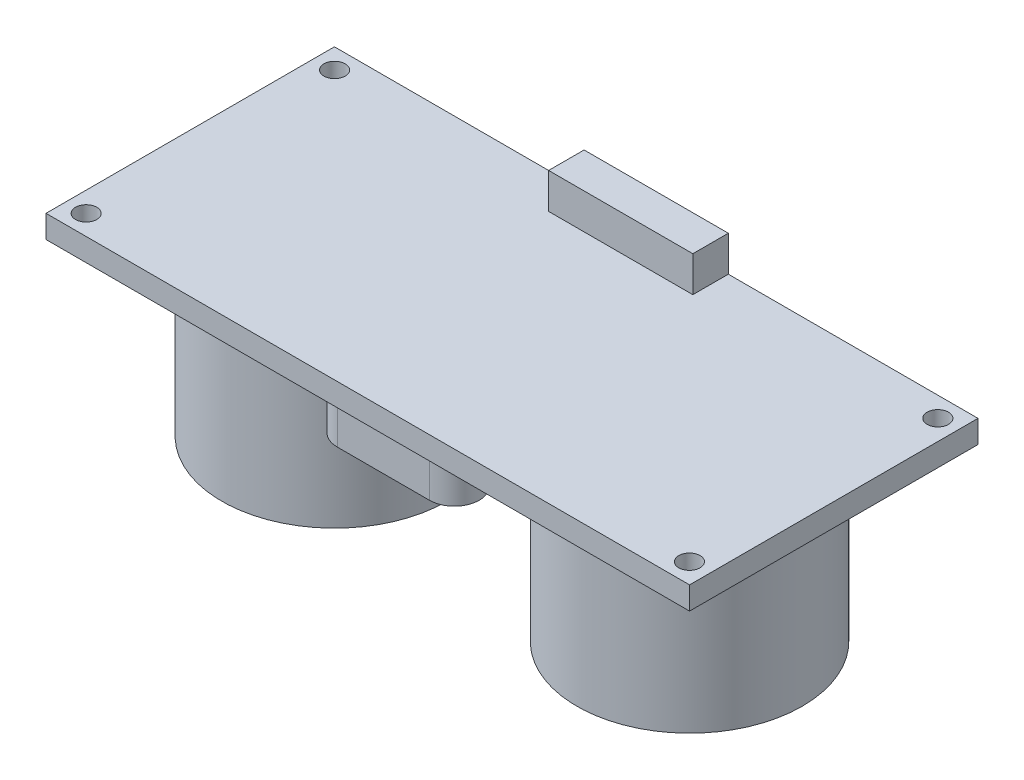
ISO-10303-21;
HEADER;
FILE_DESCRIPTION(('STEP AP214'),'2;1');
FILE_NAME('part.step','',(''),(''),'','','');
FILE_SCHEMA(('AUTOMOTIVE_DESIGN { 1 0 10303 214 1 1 1 1 }'));
ENDSEC;
DATA;
#1=APPLICATION_CONTEXT('core data for automotive mechanical design processes');
#2=APPLICATION_PROTOCOL_DEFINITION('international standard','automotive_design',2000,#1);
#3=PRODUCT_CONTEXT('',#1,'mechanical');
#4=PRODUCT('Part','Part','',(#3));
#5=PRODUCT_RELATED_PRODUCT_CATEGORY('part','',(#4));
#6=PRODUCT_DEFINITION_FORMATION('','',#4);
#7=PRODUCT_DEFINITION_CONTEXT('part definition',#1,'design');
#8=PRODUCT_DEFINITION('design','',#6,#7);
#9=PRODUCT_DEFINITION_SHAPE('','',#8);
#10=(LENGTH_UNIT() NAMED_UNIT(*) SI_UNIT(.MILLI.,.METRE.));
#11=(NAMED_UNIT(*) PLANE_ANGLE_UNIT() SI_UNIT($,.RADIAN.));
#12=(NAMED_UNIT(*) SI_UNIT($,.STERADIAN.) SOLID_ANGLE_UNIT());
#13=UNCERTAINTY_MEASURE_WITH_UNIT(LENGTH_MEASURE(1.E-05),#10,'distance_accuracy_value','');
#14=(GEOMETRIC_REPRESENTATION_CONTEXT(3) GLOBAL_UNCERTAINTY_ASSIGNED_CONTEXT((#13)) GLOBAL_UNIT_ASSIGNED_CONTEXT((#10,
#11,#12)) REPRESENTATION_CONTEXT('',''));
#15=CARTESIAN_POINT('',(0.,0.,0.));
#16=DIRECTION('',(0.,0.,1.));
#17=DIRECTION('',(1.,0.,0.));
#18=AXIS2_PLACEMENT_3D('',#15,#16,#17);
#19=CARTESIAN_POINT('',(0.,-11.,0.));
#20=DIRECTION('',(0.,1.,0.));
#21=DIRECTION('',(0.,0.,-1.));
#22=AXIS2_PLACEMENT_3D('',#19,#20,#21);
#23=PLANE('',#22);
#24=CARTESIAN_POINT('',(12.5095,-11.,0.));
#25=DIRECTION('',(0.,-1.,0.));
#26=DIRECTION('',(1.,0.,0.));
#27=AXIS2_PLACEMENT_3D('',#24,#25,#26);
#28=CIRCLE('',#27,6.25);
#29=CARTESIAN_POINT('',(18.7595,-11.,0.));
#30=VERTEX_POINT('',#29);
#31=EDGE_CURVE('E10',#30,#30,#28,.T.);
#32=ORIENTED_EDGE('',*,*,#31,.T.);
#33=EDGE_LOOP('',(#32));
#34=FACE_BOUND('',#33,.T.);
#35=ADVANCED_FACE('F17',(#34),#23,.F.);
#36=CARTESIAN_POINT('',(0.,-11.,0.));
#37=DIRECTION('',(0.,1.,0.));
#38=DIRECTION('',(0.,0.,-1.));
#39=AXIS2_PLACEMENT_3D('',#36,#37,#38);
#40=PLANE('',#39);
#41=CARTESIAN_POINT('',(-12.5095,-11.,0.));
#42=DIRECTION('',(0.,-1.,0.));
#43=DIRECTION('',(1.,0.,0.));
#44=AXIS2_PLACEMENT_3D('',#41,#42,#43);
#45=CIRCLE('',#44,6.25);
#46=CARTESIAN_POINT('',(-6.2595,-11.,0.));
#47=VERTEX_POINT('',#46);
#48=EDGE_CURVE('E40',#47,#47,#45,.T.);
#49=ORIENTED_EDGE('',*,*,#48,.T.);
#50=EDGE_LOOP('',(#49));
#51=FACE_BOUND('',#50,.T.);
#52=ADVANCED_FACE('F483',(#51),#40,.F.);
#53=CARTESIAN_POINT('',(12.5095,-12.,0.));
#54=DIRECTION('',(0.,-1.,0.));
#55=DIRECTION('',(1.,0.,0.));
#56=AXIS2_PLACEMENT_3D('',#53,#54,#55);
#57=CYLINDRICAL_SURFACE('',#56,6.25);
#58=CARTESIAN_POINT('',(12.5095,-12.,0.));
#59=DIRECTION('',(0.,-1.,0.));
#60=DIRECTION('',(1.,0.,0.));
#61=AXIS2_PLACEMENT_3D('',#58,#59,#60);
#62=CIRCLE('',#61,6.25);
#63=CARTESIAN_POINT('',(18.7595,-12.,0.));
#64=VERTEX_POINT('',#63);
#65=EDGE_CURVE('E335',#64,#64,#62,.T.);
#66=ORIENTED_EDGE('',*,*,#65,.T.);
#67=DIRECTION('',(0.,1.,0.));
#68=VECTOR('',#67,1.);
#69=CARTESIAN_POINT('',(18.7595,-12.,0.));
#70=LINE('',#69,#68);
#71=EDGE_CURVE('E25',#64,#30,#70,.T.);
#72=ORIENTED_EDGE('',*,*,#71,.T.);
#73=ORIENTED_EDGE('',*,*,#31,.F.);
#74=ORIENTED_EDGE('',*,*,#71,.F.);
#75=EDGE_LOOP('',(#66,#72,#73,#74));
#76=FACE_BOUND('',#75,.T.);
#77=ADVANCED_FACE('F353',(#76),#57,.F.);
#78=CARTESIAN_POINT('',(-12.5095,-12.,0.));
#79=DIRECTION('',(0.,-1.,0.));
#80=DIRECTION('',(1.,0.,0.));
#81=AXIS2_PLACEMENT_3D('',#78,#79,#80);
#82=CYLINDRICAL_SURFACE('',#81,6.25);
#83=CARTESIAN_POINT('',(-12.5095,-12.,0.));
#84=DIRECTION('',(0.,-1.,0.));
#85=DIRECTION('',(1.,0.,0.));
#86=AXIS2_PLACEMENT_3D('',#83,#84,#85);
#87=CIRCLE('',#86,6.25);
#88=CARTESIAN_POINT('',(-6.2595,-12.,0.));
#89=VERTEX_POINT('',#88);
#90=EDGE_CURVE('E346',#89,#89,#87,.T.);
#91=ORIENTED_EDGE('',*,*,#90,.T.);
#92=DIRECTION('',(0.,1.,0.));
#93=VECTOR('',#92,1.);
#94=CARTESIAN_POINT('',(-6.2595,-12.,0.));
#95=LINE('',#94,#93);
#96=EDGE_CURVE('E331',#89,#47,#95,.T.);
#97=ORIENTED_EDGE('',*,*,#96,.T.);
#98=ORIENTED_EDGE('',*,*,#48,.F.);
#99=ORIENTED_EDGE('',*,*,#96,.F.);
#100=EDGE_LOOP('',(#91,#97,#98,#99));
#101=FACE_BOUND('',#100,.T.);
#102=ADVANCED_FACE('F490',(#101),#82,.F.);
#103=CARTESIAN_POINT('',(0.,-12.,0.));
#104=DIRECTION('',(0.,1.,0.));
#105=DIRECTION('',(1.,0.,0.));
#106=AXIS2_PLACEMENT_3D('',#103,#104,#105);
#107=PLANE('',#106);
#108=ORIENTED_EDGE('',*,*,#65,.F.);
#109=EDGE_LOOP('',(#108));
#110=FACE_BOUND('',#109,.T.);
#111=CARTESIAN_POINT('',(12.5095,-12.,0.));
#112=DIRECTION('',(0.,-1.,0.));
#113=DIRECTION('',(1.,0.,0.));
#114=AXIS2_PLACEMENT_3D('',#111,#112,#113);
#115=CIRCLE('',#114,7.9375);
#116=CARTESIAN_POINT('',(20.447,-12.,0.));
#117=VERTEX_POINT('',#116);
#118=EDGE_CURVE('E327',#117,#117,#115,.T.);
#119=ORIENTED_EDGE('',*,*,#118,.T.);
#120=EDGE_LOOP('',(#119));
#121=FACE_BOUND('',#120,.T.);
#122=ADVANCED_FACE('F495',(#110,#121),#107,.F.);
#123=CARTESIAN_POINT('',(0.,-3.5,7.31));
#124=DIRECTION('',(0.,1.,0.));
#125=DIRECTION('',(1.,0.,0.));
#126=AXIS2_PLACEMENT_3D('',#123,#124,#125);
#127=PLANE('',#126);
#128=CARTESIAN_POINT('',(-3.25,-3.5,7.31));
#129=DIRECTION('',(0.,-1.,0.));
#130=DIRECTION('',(1.,0.,0.));
#131=AXIS2_PLACEMENT_3D('',#128,#129,#130);
#132=CIRCLE('',#131,1.75);
#133=CARTESIAN_POINT('',(-3.25,-3.5,9.06));
#134=VERTEX_POINT('',#133);
#135=CARTESIAN_POINT('',(-3.25,-3.5,5.56));
#136=VERTEX_POINT('',#135);
#137=EDGE_CURVE('E203',#134,#136,#132,.T.);
#138=ORIENTED_EDGE('',*,*,#137,.T.);
#139=DIRECTION('',(1.,0.,0.));
#140=VECTOR('',#139,1.);
#141=CARTESIAN_POINT('',(-3.25,-3.5,5.56));
#142=LINE('',#141,#140);
#143=CARTESIAN_POINT('',(3.25,-3.5,5.56));
#144=VERTEX_POINT('',#143);
#145=EDGE_CURVE('E307',#136,#144,#142,.T.);
#146=ORIENTED_EDGE('',*,*,#145,.T.);
#147=CARTESIAN_POINT('',(3.25,-3.5,7.31));
#148=DIRECTION('',(0.,-1.,0.));
#149=DIRECTION('',(1.,0.,0.));
#150=AXIS2_PLACEMENT_3D('',#147,#148,#149);
#151=CIRCLE('',#150,1.75);
#152=CARTESIAN_POINT('',(3.25,-3.5,9.06));
#153=VERTEX_POINT('',#152);
#154=EDGE_CURVE('E293',#144,#153,#151,.T.);
#155=ORIENTED_EDGE('',*,*,#154,.T.);
#156=DIRECTION('',(1.,0.,0.));
#157=VECTOR('',#156,1.);
#158=CARTESIAN_POINT('',(-3.25,-3.5,9.06));
#159=LINE('',#158,#157);
#160=EDGE_CURVE('E208',#134,#153,#159,.T.);
#161=ORIENTED_EDGE('',*,*,#160,.F.);
#162=EDGE_LOOP('',(#138,#146,#155,#161));
#163=FACE_BOUND('',#162,.T.);
#164=ADVANCED_FACE('F499',(#163),#127,.F.);
#165=CARTESIAN_POINT('',(0.,-12.,0.));
#166=DIRECTION('',(0.,1.,0.));
#167=DIRECTION('',(1.,0.,0.));
#168=AXIS2_PLACEMENT_3D('',#165,#166,#167);
#169=PLANE('',#168);
#170=ORIENTED_EDGE('',*,*,#90,.F.);
#171=EDGE_LOOP('',(#170));
#172=FACE_BOUND('',#171,.T.);
#173=CARTESIAN_POINT('',(-12.5095,-12.,0.));
#174=DIRECTION('',(0.,-1.,0.));
#175=DIRECTION('',(1.,0.,0.));
#176=AXIS2_PLACEMENT_3D('',#173,#174,#175);
#177=CIRCLE('',#176,7.9375);
#178=CARTESIAN_POINT('',(-4.572,-12.,0.));
#179=VERTEX_POINT('',#178);
#180=EDGE_CURVE('E300',#179,#179,#177,.T.);
#181=ORIENTED_EDGE('',*,*,#180,.T.);
#182=EDGE_LOOP('',(#181));
#183=FACE_BOUND('',#182,.T.);
#184=ADVANCED_FACE('F502',(#172,#183),#169,.F.);
#185=CARTESIAN_POINT('',(0.,4.1002,-8.91));
#186=DIRECTION('',(0.,1.,0.));
#187=DIRECTION('',(1.,0.,0.));
#188=AXIS2_PLACEMENT_3D('',#185,#186,#187);
#189=PLANE('',#188);
#190=DIRECTION('',(-1.,0.,0.));
#191=VECTOR('',#190,1.);
#192=CARTESIAN_POINT('',(5.08,4.1002,-10.16));
#193=LINE('',#192,#191);
#194=CARTESIAN_POINT('',(5.08,4.1002,-10.16));
#195=VERTEX_POINT('',#194);
#196=CARTESIAN_POINT('',(-5.08,4.1002,-10.16));
#197=VERTEX_POINT('',#196);
#198=EDGE_CURVE('E269',#195,#197,#193,.T.);
#199=ORIENTED_EDGE('',*,*,#198,.T.);
#200=DIRECTION('',(0.,0.,1.));
#201=VECTOR('',#200,1.);
#202=CARTESIAN_POINT('',(-5.08,4.1002,-10.16));
#203=LINE('',#202,#201);
#204=CARTESIAN_POINT('',(-5.08,4.1002,-7.66));
#205=VERTEX_POINT('',#204);
#206=EDGE_CURVE('E247',#197,#205,#203,.T.);
#207=ORIENTED_EDGE('',*,*,#206,.T.);
#208=DIRECTION('',(1.,0.,0.));
#209=VECTOR('',#208,1.);
#210=CARTESIAN_POINT('',(-5.08,4.1002,-7.66));
#211=LINE('',#210,#209);
#212=CARTESIAN_POINT('',(5.08,4.1002,-7.66));
#213=VERTEX_POINT('',#212);
#214=EDGE_CURVE('E342',#205,#213,#211,.T.);
#215=ORIENTED_EDGE('',*,*,#214,.T.);
#216=DIRECTION('',(0.,0.,-1.));
#217=VECTOR('',#216,1.);
#218=CARTESIAN_POINT('',(5.08,4.1002,-7.66));
#219=LINE('',#218,#217);
#220=EDGE_CURVE('E343',#213,#195,#219,.T.);
#221=ORIENTED_EDGE('',*,*,#220,.T.);
#222=EDGE_LOOP('',(#199,#207,#215,#221));
#223=FACE_BOUND('',#222,.T.);
#224=ADVANCED_FACE('F506',(#223),#189,.T.);
#225=CARTESIAN_POINT('',(5.08,1.6002,-7.66));
#226=DIRECTION('',(-1.,0.,0.));
#227=DIRECTION('',(0.,0.,1.));
#228=AXIS2_PLACEMENT_3D('',#225,#226,#227);
#229=PLANE('',#228);
#230=DIRECTION('',(0.,0.,-1.));
#231=VECTOR('',#230,1.);
#232=CARTESIAN_POINT('',(5.08,1.6002,-7.66));
#233=LINE('',#232,#231);
#234=CARTESIAN_POINT('',(5.08,1.6002,-7.66));
#235=VERTEX_POINT('',#234);
#236=CARTESIAN_POINT('',(5.08,1.6002,-10.16));
#237=VERTEX_POINT('',#236);
#238=EDGE_CURVE('E255',#235,#237,#233,.T.);
#239=ORIENTED_EDGE('',*,*,#238,.T.);
#240=DIRECTION('',(0.,1.,0.));
#241=VECTOR('',#240,1.);
#242=CARTESIAN_POINT('',(5.08,1.6002,-10.16));
#243=LINE('',#242,#241);
#244=EDGE_CURVE('E273',#237,#195,#243,.T.);
#245=ORIENTED_EDGE('',*,*,#244,.T.);
#246=ORIENTED_EDGE('',*,*,#220,.F.);
#247=DIRECTION('',(0.,1.,0.));
#248=VECTOR('',#247,1.);
#249=CARTESIAN_POINT('',(5.08,1.6002,-7.66));
#250=LINE('',#249,#248);
#251=EDGE_CURVE('E251',#235,#213,#250,.T.);
#252=ORIENTED_EDGE('',*,*,#251,.F.);
#253=EDGE_LOOP('',(#239,#245,#246,#252));
#254=FACE_BOUND('',#253,.T.);
#255=ADVANCED_FACE('F508',(#254),#229,.F.);
#256=CARTESIAN_POINT('',(-5.08,1.6002,-7.66));
#257=DIRECTION('',(0.,0.,-1.));
#258=DIRECTION('',(0.,-1.,0.));
#259=AXIS2_PLACEMENT_3D('',#256,#257,#258);
#260=PLANE('',#259);
#261=DIRECTION('',(1.,0.,0.));
#262=VECTOR('',#261,1.);
#263=CARTESIAN_POINT('',(-5.08,1.6002,-7.66));
#264=LINE('',#263,#262);
#265=CARTESIAN_POINT('',(-5.08,1.6002,-7.66));
#266=VERTEX_POINT('',#265);
#267=EDGE_CURVE('E256',#266,#235,#264,.T.);
#268=ORIENTED_EDGE('',*,*,#267,.T.);
#269=ORIENTED_EDGE('',*,*,#251,.T.);
#270=ORIENTED_EDGE('',*,*,#214,.F.);
#271=DIRECTION('',(0.,1.,0.));
#272=VECTOR('',#271,1.);
#273=CARTESIAN_POINT('',(-5.08,1.6002,-7.66));
#274=LINE('',#273,#272);
#275=EDGE_CURVE('E252',#266,#205,#274,.T.);
#276=ORIENTED_EDGE('',*,*,#275,.F.);
#277=EDGE_LOOP('',(#268,#269,#270,#276));
#278=FACE_BOUND('',#277,.T.);
#279=ADVANCED_FACE('F511',(#278),#260,.F.);
#280=CARTESIAN_POINT('',(-5.08,1.6002,-10.16));
#281=DIRECTION('',(1.,0.,0.));
#282=DIRECTION('',(0.,1.,0.));
#283=AXIS2_PLACEMENT_3D('',#280,#281,#282);
#284=PLANE('',#283);
#285=DIRECTION('',(0.,0.,1.));
#286=VECTOR('',#285,1.);
#287=CARTESIAN_POINT('',(-5.08,1.6002,-10.16));
#288=LINE('',#287,#286);
#289=CARTESIAN_POINT('',(-5.08,1.6002,-10.16));
#290=VERTEX_POINT('',#289);
#291=EDGE_CURVE('E260',#290,#266,#288,.T.);
#292=ORIENTED_EDGE('',*,*,#291,.T.);
#293=ORIENTED_EDGE('',*,*,#275,.T.);
#294=ORIENTED_EDGE('',*,*,#206,.F.);
#295=DIRECTION('',(0.,1.,0.));
#296=VECTOR('',#295,1.);
#297=CARTESIAN_POINT('',(-5.08,1.6002,-10.16));
#298=LINE('',#297,#296);
#299=EDGE_CURVE('E274',#290,#197,#298,.T.);
#300=ORIENTED_EDGE('',*,*,#299,.F.);
#301=EDGE_LOOP('',(#292,#293,#294,#300));
#302=FACE_BOUND('',#301,.T.);
#303=ADVANCED_FACE('F515',(#302),#284,.F.);
#304=CARTESIAN_POINT('',(21.25,0.,8.75));
#305=DIRECTION('',(0.,-1.,0.));
#306=DIRECTION('',(1.,0.,0.));
#307=AXIS2_PLACEMENT_3D('',#304,#305,#306);
#308=CYLINDRICAL_SURFACE('',#307,0.75);
#309=CARTESIAN_POINT('',(21.25,0.,8.75));
#310=DIRECTION('',(0.,-1.,0.));
#311=DIRECTION('',(1.,0.,0.));
#312=AXIS2_PLACEMENT_3D('',#309,#310,#311);
#313=CIRCLE('',#312,0.75);
#314=CARTESIAN_POINT('',(22.,0.,8.75));
#315=VERTEX_POINT('',#314);
#316=EDGE_CURVE('E242',#315,#315,#313,.T.);
#317=ORIENTED_EDGE('',*,*,#316,.T.);
#318=DIRECTION('',(0.,1.,0.));
#319=VECTOR('',#318,1.);
#320=CARTESIAN_POINT('',(22.,0.,8.75));
#321=LINE('',#320,#319);
#322=CARTESIAN_POINT('',(22.,1.6002,8.75));
#323=VERTEX_POINT('',#322);
#324=EDGE_CURVE('E330',#315,#323,#321,.T.);
#325=ORIENTED_EDGE('',*,*,#324,.T.);
#326=CARTESIAN_POINT('',(21.25,1.6002,8.75));
#327=DIRECTION('',(0.,-1.,0.));
#328=DIRECTION('',(1.,0.,0.));
#329=AXIS2_PLACEMENT_3D('',#326,#327,#328);
#330=CIRCLE('',#329,0.75);
#331=EDGE_CURVE('E279',#323,#323,#330,.T.);
#332=ORIENTED_EDGE('',*,*,#331,.F.);
#333=ORIENTED_EDGE('',*,*,#324,.F.);
#334=EDGE_LOOP('',(#317,#325,#332,#333));
#335=FACE_BOUND('',#334,.T.);
#336=ADVANCED_FACE('F519',(#335),#308,.F.);
#337=CARTESIAN_POINT('',(12.5095,0.,0.));
#338=DIRECTION('',(0.,1.,0.));
#339=DIRECTION('',(1.,0.,0.));
#340=AXIS2_PLACEMENT_3D('',#337,#338,#339);
#341=CYLINDRICAL_SURFACE('',#340,7.9375);
#342=CARTESIAN_POINT('',(12.5095,0.,0.));
#343=DIRECTION('',(0.,-1.,0.));
#344=DIRECTION('',(1.,0.,0.));
#345=AXIS2_PLACEMENT_3D('',#342,#343,#344);
#346=CIRCLE('',#345,7.9375);
#347=CARTESIAN_POINT('',(20.447,0.,0.));
#348=VERTEX_POINT('',#347);
#349=EDGE_CURVE('E220',#348,#348,#346,.T.);
#350=ORIENTED_EDGE('',*,*,#349,.T.);
#351=DIRECTION('',(0.,-1.,0.));
#352=VECTOR('',#351,1.);
#353=CARTESIAN_POINT('',(20.447,0.,0.));
#354=LINE('',#353,#352);
#355=EDGE_CURVE('E323',#348,#117,#354,.T.);
#356=ORIENTED_EDGE('',*,*,#355,.T.);
#357=ORIENTED_EDGE('',*,*,#118,.F.);
#358=ORIENTED_EDGE('',*,*,#355,.F.);
#359=EDGE_LOOP('',(#350,#356,#357,#358));
#360=FACE_BOUND('',#359,.T.);
#361=ADVANCED_FACE('F522',(#360),#341,.T.);
#362=CARTESIAN_POINT('',(-3.25,0.,7.31));
#363=DIRECTION('',(0.,1.,0.));
#364=DIRECTION('',(1.,0.,0.));
#365=AXIS2_PLACEMENT_3D('',#362,#363,#364);
#366=CYLINDRICAL_SURFACE('',#365,1.75);
#367=CARTESIAN_POINT('',(-3.25,0.,7.31));
#368=DIRECTION('',(0.,-1.,0.));
#369=DIRECTION('',(1.,0.,0.));
#370=AXIS2_PLACEMENT_3D('',#367,#368,#369);
#371=CIRCLE('',#370,1.75);
#372=CARTESIAN_POINT('',(-3.25,0.,9.06));
#373=VERTEX_POINT('',#372);
#374=CARTESIAN_POINT('',(-3.25,0.,5.56));
#375=VERTEX_POINT('',#374);
#376=EDGE_CURVE('E201',#373,#375,#371,.T.);
#377=ORIENTED_EDGE('',*,*,#376,.T.);
#378=DIRECTION('',(0.,-1.,0.));
#379=VECTOR('',#378,1.);
#380=CARTESIAN_POINT('',(-3.25,0.,5.56));
#381=LINE('',#380,#379);
#382=EDGE_CURVE('E318',#375,#136,#381,.T.);
#383=ORIENTED_EDGE('',*,*,#382,.T.);
#384=ORIENTED_EDGE('',*,*,#137,.F.);
#385=DIRECTION('',(0.,-1.,0.));
#386=VECTOR('',#385,1.);
#387=CARTESIAN_POINT('',(-3.25,0.,9.06));
#388=LINE('',#387,#386);
#389=EDGE_CURVE('E196',#373,#134,#388,.T.);
#390=ORIENTED_EDGE('',*,*,#389,.F.);
#391=EDGE_LOOP('',(#377,#383,#384,#390));
#392=FACE_BOUND('',#391,.T.);
#393=ADVANCED_FACE('F198',(#392),#366,.T.);
#394=CARTESIAN_POINT('',(-3.25,0.,5.56));
#395=DIRECTION('',(0.,0.,1.));
#396=DIRECTION('',(0.,-1.,0.));
#397=AXIS2_PLACEMENT_3D('',#394,#395,#396);
#398=PLANE('',#397);
#399=DIRECTION('',(1.,0.,0.));
#400=VECTOR('',#399,1.);
#401=CARTESIAN_POINT('',(-3.25,0.,5.56));
#402=LINE('',#401,#400);
#403=CARTESIAN_POINT('',(3.25,0.,5.56));
#404=VERTEX_POINT('',#403);
#405=EDGE_CURVE('E225',#375,#404,#402,.T.);
#406=ORIENTED_EDGE('',*,*,#405,.T.);
#407=DIRECTION('',(0.,-1.,0.));
#408=VECTOR('',#407,1.);
#409=CARTESIAN_POINT('',(3.25,0.,5.56));
#410=LINE('',#409,#408);
#411=EDGE_CURVE('E296',#404,#144,#410,.T.);
#412=ORIENTED_EDGE('',*,*,#411,.T.);
#413=ORIENTED_EDGE('',*,*,#145,.F.);
#414=ORIENTED_EDGE('',*,*,#382,.F.);
#415=EDGE_LOOP('',(#406,#412,#413,#414));
#416=FACE_BOUND('',#415,.T.);
#417=ADVANCED_FACE('F527',(#416),#398,.F.);
#418=CARTESIAN_POINT('',(3.25,0.,7.31));
#419=DIRECTION('',(0.,1.,0.));
#420=DIRECTION('',(1.,0.,0.));
#421=AXIS2_PLACEMENT_3D('',#418,#419,#420);
#422=CYLINDRICAL_SURFACE('',#421,1.75);
#423=CARTESIAN_POINT('',(3.25,0.,7.31));
#424=DIRECTION('',(0.,-1.,0.));
#425=DIRECTION('',(1.,0.,0.));
#426=AXIS2_PLACEMENT_3D('',#423,#424,#425);
#427=CIRCLE('',#426,1.75);
#428=CARTESIAN_POINT('',(3.25,0.,9.06));
#429=VERTEX_POINT('',#428);
#430=EDGE_CURVE('E232',#404,#429,#427,.T.);
#431=ORIENTED_EDGE('',*,*,#430,.T.);
#432=DIRECTION('',(0.,-1.,0.));
#433=VECTOR('',#432,1.);
#434=CARTESIAN_POINT('',(3.25,0.,9.06));
#435=LINE('',#434,#433);
#436=EDGE_CURVE('E215',#429,#153,#435,.T.);
#437=ORIENTED_EDGE('',*,*,#436,.T.);
#438=ORIENTED_EDGE('',*,*,#154,.F.);
#439=ORIENTED_EDGE('',*,*,#411,.F.);
#440=EDGE_LOOP('',(#431,#437,#438,#439));
#441=FACE_BOUND('',#440,.T.);
#442=ADVANCED_FACE('F524',(#441),#422,.T.);
#443=CARTESIAN_POINT('',(-3.25,0.,9.06));
#444=DIRECTION('',(0.,0.,1.));
#445=DIRECTION('',(0.,-1.,0.));
#446=AXIS2_PLACEMENT_3D('',#443,#444,#445);
#447=PLANE('',#446);
#448=ORIENTED_EDGE('',*,*,#389,.T.);
#449=ORIENTED_EDGE('',*,*,#160,.T.);
#450=ORIENTED_EDGE('',*,*,#436,.F.);
#451=DIRECTION('',(1.,0.,0.));
#452=VECTOR('',#451,1.);
#453=CARTESIAN_POINT('',(-3.25,0.,9.06));
#454=LINE('',#453,#452);
#455=EDGE_CURVE('E212',#373,#429,#454,.T.);
#456=ORIENTED_EDGE('',*,*,#455,.F.);
#457=EDGE_LOOP('',(#448,#449,#450,#456));
#458=FACE_BOUND('',#457,.T.);
#459=ADVANCED_FACE('F213',(#458),#447,.T.);
#460=CARTESIAN_POINT('',(21.25,0.,-8.75));
#461=DIRECTION('',(0.,-1.,0.));
#462=DIRECTION('',(1.,0.,0.));
#463=AXIS2_PLACEMENT_3D('',#460,#461,#462);
#464=CYLINDRICAL_SURFACE('',#463,0.75);
#465=CARTESIAN_POINT('',(21.25,0.,-8.75));
#466=DIRECTION('',(0.,-1.,0.));
#467=DIRECTION('',(1.,0.,0.));
#468=AXIS2_PLACEMENT_3D('',#465,#466,#467);
#469=CIRCLE('',#468,0.75);
#470=CARTESIAN_POINT('',(22.,0.,-8.75));
#471=VERTEX_POINT('',#470);
#472=EDGE_CURVE('E236',#471,#471,#469,.T.);
#473=ORIENTED_EDGE('',*,*,#472,.T.);
#474=DIRECTION('',(0.,1.,0.));
#475=VECTOR('',#474,1.);
#476=CARTESIAN_POINT('',(22.,0.,-8.75));
#477=LINE('',#476,#475);
#478=CARTESIAN_POINT('',(22.,1.6002,-8.75));
#479=VERTEX_POINT('',#478);
#480=EDGE_CURVE('E209',#471,#479,#477,.T.);
#481=ORIENTED_EDGE('',*,*,#480,.T.);
#482=CARTESIAN_POINT('',(21.25,1.6002,-8.75));
#483=DIRECTION('',(0.,-1.,0.));
#484=DIRECTION('',(1.,0.,0.));
#485=AXIS2_PLACEMENT_3D('',#482,#483,#484);
#486=CIRCLE('',#485,0.75);
#487=EDGE_CURVE('E278',#479,#479,#486,.T.);
#488=ORIENTED_EDGE('',*,*,#487,.F.);
#489=ORIENTED_EDGE('',*,*,#480,.F.);
#490=EDGE_LOOP('',(#473,#481,#488,#489));
#491=FACE_BOUND('',#490,.T.);
#492=ADVANCED_FACE('F531',(#491),#464,.F.);
#493=CARTESIAN_POINT('',(-21.25,0.,8.75));
#494=DIRECTION('',(0.,-1.,0.));
#495=DIRECTION('',(1.,0.,0.));
#496=AXIS2_PLACEMENT_3D('',#493,#494,#495);
#497=CYLINDRICAL_SURFACE('',#496,0.75);
#498=CARTESIAN_POINT('',(-21.25,0.,8.75));
#499=DIRECTION('',(0.,-1.,0.));
#500=DIRECTION('',(1.,0.,0.));
#501=AXIS2_PLACEMENT_3D('',#498,#499,#500);
#502=CIRCLE('',#501,0.75);
#503=CARTESIAN_POINT('',(-20.5,0.,8.75));
#504=VERTEX_POINT('',#503);
#505=EDGE_CURVE('E432',#504,#504,#502,.T.);
#506=ORIENTED_EDGE('',*,*,#505,.T.);
#507=DIRECTION('',(0.,1.,0.));
#508=VECTOR('',#507,1.);
#509=CARTESIAN_POINT('',(-20.5,0.,8.75));
#510=LINE('',#509,#508);
#511=CARTESIAN_POINT('',(-20.5,1.6002,8.75));
#512=VERTEX_POINT('',#511);
#513=EDGE_CURVE('E303',#504,#512,#510,.T.);
#514=ORIENTED_EDGE('',*,*,#513,.T.);
#515=CARTESIAN_POINT('',(-21.25,1.6002,8.75));
#516=DIRECTION('',(0.,-1.,0.));
#517=DIRECTION('',(1.,0.,0.));
#518=AXIS2_PLACEMENT_3D('',#515,#516,#517);
#519=CIRCLE('',#518,0.75);
#520=EDGE_CURVE('E268',#512,#512,#519,.T.);
#521=ORIENTED_EDGE('',*,*,#520,.F.);
#522=ORIENTED_EDGE('',*,*,#513,.F.);
#523=EDGE_LOOP('',(#506,#514,#521,#522));
#524=FACE_BOUND('',#523,.T.);
#525=ADVANCED_FACE('F532',(#524),#497,.F.);
#526=CARTESIAN_POINT('',(-12.5095,0.,0.));
#527=DIRECTION('',(0.,1.,0.));
#528=DIRECTION('',(1.,0.,0.));
#529=AXIS2_PLACEMENT_3D('',#526,#527,#528);
#530=CYLINDRICAL_SURFACE('',#529,7.9375);
#531=CARTESIAN_POINT('',(-12.5095,0.,0.));
#532=DIRECTION('',(0.,-1.,0.));
#533=DIRECTION('',(1.,0.,0.));
#534=AXIS2_PLACEMENT_3D('',#531,#532,#533);
#535=CIRCLE('',#534,7.9375);
#536=CARTESIAN_POINT('',(-4.572,0.,0.));
#537=VERTEX_POINT('',#536);
#538=EDGE_CURVE('E426',#537,#537,#535,.T.);
#539=ORIENTED_EDGE('',*,*,#538,.T.);
#540=DIRECTION('',(0.,-1.,0.));
#541=VECTOR('',#540,1.);
#542=CARTESIAN_POINT('',(-4.572,0.,0.));
#543=LINE('',#542,#541);
#544=EDGE_CURVE('E292',#537,#179,#543,.T.);
#545=ORIENTED_EDGE('',*,*,#544,.T.);
#546=ORIENTED_EDGE('',*,*,#180,.F.);
#547=ORIENTED_EDGE('',*,*,#544,.F.);
#548=EDGE_LOOP('',(#539,#545,#546,#547));
#549=FACE_BOUND('',#548,.T.);
#550=ADVANCED_FACE('F535',(#549),#530,.T.);
#551=CARTESIAN_POINT('',(-21.25,0.,-8.75));
#552=DIRECTION('',(0.,-1.,0.));
#553=DIRECTION('',(1.,0.,0.));
#554=AXIS2_PLACEMENT_3D('',#551,#552,#553);
#555=CYLINDRICAL_SURFACE('',#554,0.75);
#556=CARTESIAN_POINT('',(-21.25,0.,-8.75));
#557=DIRECTION('',(0.,-1.,0.));
#558=DIRECTION('',(1.,0.,0.));
#559=AXIS2_PLACEMENT_3D('',#556,#557,#558);
#560=CIRCLE('',#559,0.75);
#561=CARTESIAN_POINT('',(-20.5,0.,-8.75));
#562=VERTEX_POINT('',#561);
#563=EDGE_CURVE('E366',#562,#562,#560,.T.);
#564=ORIENTED_EDGE('',*,*,#563,.T.);
#565=DIRECTION('',(0.,1.,0.));
#566=VECTOR('',#565,1.);
#567=CARTESIAN_POINT('',(-20.5,0.,-8.75));
#568=LINE('',#567,#566);
#569=CARTESIAN_POINT('',(-20.5,1.6002,-8.75));
#570=VERTEX_POINT('',#569);
#571=EDGE_CURVE('E288',#562,#570,#568,.T.);
#572=ORIENTED_EDGE('',*,*,#571,.T.);
#573=CARTESIAN_POINT('',(-21.25,1.6002,-8.75));
#574=DIRECTION('',(0.,-1.,0.));
#575=DIRECTION('',(1.,0.,0.));
#576=AXIS2_PLACEMENT_3D('',#573,#574,#575);
#577=CIRCLE('',#576,0.75);
#578=EDGE_CURVE('E264',#570,#570,#577,.T.);
#579=ORIENTED_EDGE('',*,*,#578,.F.);
#580=ORIENTED_EDGE('',*,*,#571,.F.);
#581=EDGE_LOOP('',(#564,#572,#579,#580));
#582=FACE_BOUND('',#581,.T.);
#583=ADVANCED_FACE('F539',(#582),#555,.F.);
#584=CARTESIAN_POINT('',(22.6695,0.,10.16));
#585=DIRECTION('',(0.,0.,1.));
#586=DIRECTION('',(0.,-1.,0.));
#587=AXIS2_PLACEMENT_3D('',#584,#585,#586);
#588=PLANE('',#587);
#589=DIRECTION('',(0.,1.,0.));
#590=VECTOR('',#589,1.);
#591=CARTESIAN_POINT('',(22.6695,0.,10.16));
#592=LINE('',#591,#590);
#593=CARTESIAN_POINT('',(22.6695,0.,10.16));
#594=VERTEX_POINT('',#593);
#595=CARTESIAN_POINT('',(22.6695,1.6002,10.16));
#596=VERTEX_POINT('',#595);
#597=EDGE_CURVE('E380',#594,#596,#592,.T.);
#598=ORIENTED_EDGE('',*,*,#597,.T.);
#599=DIRECTION('',(-1.,0.,0.));
#600=VECTOR('',#599,1.);
#601=CARTESIAN_POINT('',(22.6695,1.6002,10.16));
#602=LINE('',#601,#600);
#603=CARTESIAN_POINT('',(-22.6695,1.6002,10.16));
#604=VERTEX_POINT('',#603);
#605=EDGE_CURVE('E246',#596,#604,#602,.T.);
#606=ORIENTED_EDGE('',*,*,#605,.T.);
#607=DIRECTION('',(0.,1.,0.));
#608=VECTOR('',#607,1.);
#609=CARTESIAN_POINT('',(-22.6695,0.,10.16));
#610=LINE('',#609,#608);
#611=CARTESIAN_POINT('',(-22.6695,0.,10.16));
#612=VERTEX_POINT('',#611);
#613=EDGE_CURVE('E397',#612,#604,#610,.T.);
#614=ORIENTED_EDGE('',*,*,#613,.F.);
#615=DIRECTION('',(-1.,0.,0.));
#616=VECTOR('',#615,1.);
#617=CARTESIAN_POINT('',(22.6695,0.,10.16));
#618=LINE('',#617,#616);
#619=EDGE_CURVE('E420',#594,#612,#618,.T.);
#620=ORIENTED_EDGE('',*,*,#619,.F.);
#621=EDGE_LOOP('',(#598,#606,#614,#620));
#622=FACE_BOUND('',#621,.T.);
#623=ADVANCED_FACE('F542',(#622),#588,.T.);
#624=CARTESIAN_POINT('',(5.08,1.6002,-10.16));
#625=DIRECTION('',(0.,0.,1.));
#626=DIRECTION('',(1.,0.,0.));
#627=AXIS2_PLACEMENT_3D('',#624,#625,#626);
#628=PLANE('',#627);
#629=DIRECTION('',(1.,0.,0.));
#630=VECTOR('',#629,1.);
#631=CARTESIAN_POINT('',(-22.6695,1.6002,-10.16));
#632=LINE('',#631,#630);
#633=EDGE_CURVE('E374',#290,#237,#632,.T.);
#634=ORIENTED_EDGE('',*,*,#633,.F.);
#635=ORIENTED_EDGE('',*,*,#299,.T.);
#636=ORIENTED_EDGE('',*,*,#198,.F.);
#637=ORIENTED_EDGE('',*,*,#244,.F.);
#638=EDGE_LOOP('',(#634,#635,#636,#637));
#639=FACE_BOUND('',#638,.T.);
#640=ADVANCED_FACE('F461',(#639),#628,.F.);
#641=CARTESIAN_POINT('',(0.,1.6002,0.));
#642=DIRECTION('',(0.,1.,0.));
#643=DIRECTION('',(1.,0.,0.));
#644=AXIS2_PLACEMENT_3D('',#641,#642,#643);
#645=PLANE('',#644);
#646=ORIENTED_EDGE('',*,*,#331,.T.);
#647=EDGE_LOOP('',(#646));
#648=FACE_BOUND('',#647,.T.);
#649=ORIENTED_EDGE('',*,*,#487,.T.);
#650=EDGE_LOOP('',(#649));
#651=FACE_BOUND('',#650,.T.);
#652=ORIENTED_EDGE('',*,*,#520,.T.);
#653=EDGE_LOOP('',(#652));
#654=FACE_BOUND('',#653,.T.);
#655=ORIENTED_EDGE('',*,*,#578,.T.);
#656=EDGE_LOOP('',(#655));
#657=FACE_BOUND('',#656,.T.);
#658=DIRECTION('',(1.,0.,0.));
#659=VECTOR('',#658,1.);
#660=CARTESIAN_POINT('',(-22.6695,1.6002,-10.16));
#661=LINE('',#660,#659);
#662=CARTESIAN_POINT('',(-22.6695,1.6002,-10.16));
#663=VERTEX_POINT('',#662);
#664=EDGE_CURVE('E370',#663,#290,#661,.T.);
#665=ORIENTED_EDGE('',*,*,#664,.F.);
#666=DIRECTION('',(0.,0.,-1.));
#667=VECTOR('',#666,1.);
#668=CARTESIAN_POINT('',(-22.6695,1.6002,10.16));
#669=LINE('',#668,#667);
#670=EDGE_CURVE('E401',#604,#663,#669,.T.);
#671=ORIENTED_EDGE('',*,*,#670,.F.);
#672=ORIENTED_EDGE('',*,*,#605,.F.);
#673=DIRECTION('',(0.,0.,1.));
#674=VECTOR('',#673,1.);
#675=CARTESIAN_POINT('',(22.6695,1.6002,-10.16));
#676=LINE('',#675,#674);
#677=CARTESIAN_POINT('',(22.6695,1.6002,-10.16));
#678=VERTEX_POINT('',#677);
#679=EDGE_CURVE('E385',#678,#596,#676,.T.);
#680=ORIENTED_EDGE('',*,*,#679,.F.);
#681=DIRECTION('',(1.,0.,0.));
#682=VECTOR('',#681,1.);
#683=CARTESIAN_POINT('',(-22.6695,1.6002,-10.16));
#684=LINE('',#683,#682);
#685=EDGE_CURVE('E379',#237,#678,#684,.T.);
#686=ORIENTED_EDGE('',*,*,#685,.F.);
#687=ORIENTED_EDGE('',*,*,#238,.F.);
#688=ORIENTED_EDGE('',*,*,#267,.F.);
#689=ORIENTED_EDGE('',*,*,#291,.F.);
#690=EDGE_LOOP('',(#665,#671,#672,#680,#686,#687,#688,#689));
#691=FACE_BOUND('',#690,.T.);
#692=ADVANCED_FACE('F455',(#648,#651,#654,#657,#691),#645,.T.);
#693=CARTESIAN_POINT('',(0.,0.,0.));
#694=DIRECTION('',(0.,1.,0.));
#695=DIRECTION('',(1.,0.,0.));
#696=AXIS2_PLACEMENT_3D('',#693,#694,#695);
#697=PLANE('',#696);
#698=ORIENTED_EDGE('',*,*,#316,.F.);
#699=EDGE_LOOP('',(#698));
#700=FACE_BOUND('',#699,.T.);
#701=ORIENTED_EDGE('',*,*,#349,.F.);
#702=EDGE_LOOP('',(#701));
#703=FACE_BOUND('',#702,.T.);
#704=ORIENTED_EDGE('',*,*,#430,.F.);
#705=ORIENTED_EDGE('',*,*,#405,.F.);
#706=ORIENTED_EDGE('',*,*,#376,.F.);
#707=ORIENTED_EDGE('',*,*,#455,.T.);
#708=EDGE_LOOP('',(#704,#705,#706,#707));
#709=FACE_BOUND('',#708,.T.);
#710=ORIENTED_EDGE('',*,*,#472,.F.);
#711=EDGE_LOOP('',(#710));
#712=FACE_BOUND('',#711,.T.);
#713=ORIENTED_EDGE('',*,*,#505,.F.);
#714=EDGE_LOOP('',(#713));
#715=FACE_BOUND('',#714,.T.);
#716=ORIENTED_EDGE('',*,*,#538,.F.);
#717=EDGE_LOOP('',(#716));
#718=FACE_BOUND('',#717,.T.);
#719=ORIENTED_EDGE('',*,*,#563,.F.);
#720=EDGE_LOOP('',(#719));
#721=FACE_BOUND('',#720,.T.);
#722=DIRECTION('',(0.,0.,1.));
#723=VECTOR('',#722,1.);
#724=CARTESIAN_POINT('',(22.6695,0.,-10.16));
#725=LINE('',#724,#723);
#726=CARTESIAN_POINT('',(22.6695,0.,-10.16));
#727=VERTEX_POINT('',#726);
#728=EDGE_CURVE('E384',#727,#594,#725,.T.);
#729=ORIENTED_EDGE('',*,*,#728,.T.);
#730=ORIENTED_EDGE('',*,*,#619,.T.);
#731=DIRECTION('',(0.,0.,-1.));
#732=VECTOR('',#731,1.);
#733=CARTESIAN_POINT('',(-22.6695,0.,10.16));
#734=LINE('',#733,#732);
#735=CARTESIAN_POINT('',(-22.6695,0.,-10.16));
#736=VERTEX_POINT('',#735);
#737=EDGE_CURVE('E409',#612,#736,#734,.T.);
#738=ORIENTED_EDGE('',*,*,#737,.T.);
#739=DIRECTION('',(1.,0.,0.));
#740=VECTOR('',#739,1.);
#741=CARTESIAN_POINT('',(-22.6695,0.,-10.16));
#742=LINE('',#741,#740);
#743=EDGE_CURVE('E393',#736,#727,#742,.T.);
#744=ORIENTED_EDGE('',*,*,#743,.T.);
#745=EDGE_LOOP('',(#729,#730,#738,#744));
#746=FACE_BOUND('',#745,.T.);
#747=ADVANCED_FACE('F222',(#700,#703,#709,#712,#715,#718,#721,#746),#697,.F.);
#748=CARTESIAN_POINT('',(22.6695,0.,-10.16));
#749=DIRECTION('',(1.,0.,0.));
#750=DIRECTION('',(0.,1.,0.));
#751=AXIS2_PLACEMENT_3D('',#748,#749,#750);
#752=PLANE('',#751);
#753=DIRECTION('',(0.,1.,0.));
#754=VECTOR('',#753,1.);
#755=CARTESIAN_POINT('',(22.6695,0.,-10.16));
#756=LINE('',#755,#754);
#757=EDGE_CURVE('E389',#727,#678,#756,.T.);
#758=ORIENTED_EDGE('',*,*,#757,.T.);
#759=ORIENTED_EDGE('',*,*,#679,.T.);
#760=ORIENTED_EDGE('',*,*,#597,.F.);
#761=ORIENTED_EDGE('',*,*,#728,.F.);
#762=EDGE_LOOP('',(#758,#759,#760,#761));
#763=FACE_BOUND('',#762,.T.);
#764=ADVANCED_FACE('F466',(#763),#752,.T.);
#765=CARTESIAN_POINT('',(-22.6695,0.,10.16));
#766=DIRECTION('',(-1.,0.,0.));
#767=DIRECTION('',(0.,0.,1.));
#768=AXIS2_PLACEMENT_3D('',#765,#766,#767);
#769=PLANE('',#768);
#770=ORIENTED_EDGE('',*,*,#613,.T.);
#771=ORIENTED_EDGE('',*,*,#670,.T.);
#772=DIRECTION('',(0.,1.,0.));
#773=VECTOR('',#772,1.);
#774=CARTESIAN_POINT('',(-22.6695,0.,-10.16));
#775=LINE('',#774,#773);
#776=EDGE_CURVE('E375',#736,#663,#775,.T.);
#777=ORIENTED_EDGE('',*,*,#776,.F.);
#778=ORIENTED_EDGE('',*,*,#737,.F.);
#779=EDGE_LOOP('',(#770,#771,#777,#778));
#780=FACE_BOUND('',#779,.T.);
#781=ADVANCED_FACE('F450',(#780),#769,.T.);
#782=CARTESIAN_POINT('',(-22.6695,0.,-10.16));
#783=DIRECTION('',(0.,0.,-1.));
#784=DIRECTION('',(0.,-1.,0.));
#785=AXIS2_PLACEMENT_3D('',#782,#783,#784);
#786=PLANE('',#785);
#787=ORIENTED_EDGE('',*,*,#776,.T.);
#788=ORIENTED_EDGE('',*,*,#664,.T.);
#789=ORIENTED_EDGE('',*,*,#633,.T.);
#790=ORIENTED_EDGE('',*,*,#685,.T.);
#791=ORIENTED_EDGE('',*,*,#757,.F.);
#792=ORIENTED_EDGE('',*,*,#743,.F.);
#793=EDGE_LOOP('',(#787,#788,#789,#790,#791,#792));
#794=FACE_BOUND('',#793,.T.);
#795=ADVANCED_FACE('F446',(#794),#786,.T.);
#796=CLOSED_SHELL('',(#35,#52,#77,#102,#122,#164,#184,#224,#255,#279,#303,#336,#361,#393,#417,
#442,#459,#492,#525,#550,#583,#623,#640,#692,#747,#764,#781,#795));
#797=MANIFOLD_SOLID_BREP('B1',#796);
#798=ADVANCED_BREP_SHAPE_REPRESENTATION('',(#18,#797),#14);
#799=SHAPE_DEFINITION_REPRESENTATION(#9,#798);
ENDSEC;
END-ISO-10303-21;
